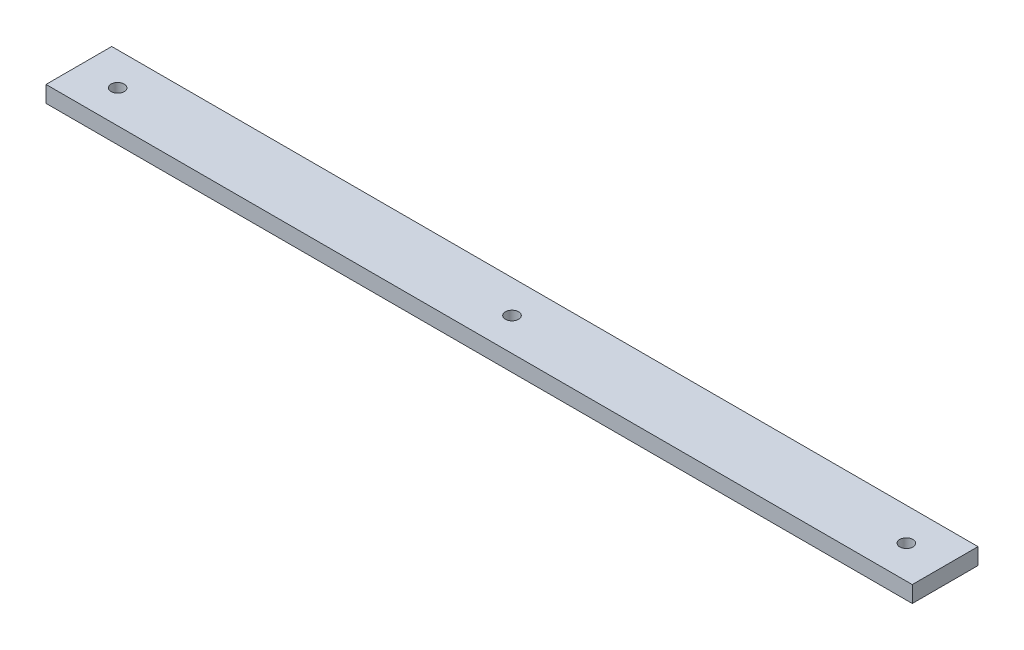
ISO-10303-21;
HEADER;
FILE_DESCRIPTION(('STEP AP214'),'2;1');
FILE_NAME('part.step','',(''),(''),'','','');
FILE_SCHEMA(('AUTOMOTIVE_DESIGN { 1 0 10303 214 1 1 1 1 }'));
ENDSEC;
DATA;
#1=APPLICATION_CONTEXT('core data for automotive mechanical design processes');
#2=APPLICATION_PROTOCOL_DEFINITION('international standard','automotive_design',2000,#1);
#3=PRODUCT_CONTEXT('',#1,'mechanical');
#4=PRODUCT('Part','Part','',(#3));
#5=PRODUCT_RELATED_PRODUCT_CATEGORY('part','',(#4));
#6=PRODUCT_DEFINITION_FORMATION('','',#4);
#7=PRODUCT_DEFINITION_CONTEXT('part definition',#1,'design');
#8=PRODUCT_DEFINITION('design','',#6,#7);
#9=PRODUCT_DEFINITION_SHAPE('','',#8);
#10=(LENGTH_UNIT() NAMED_UNIT(*) SI_UNIT(.MILLI.,.METRE.));
#11=(NAMED_UNIT(*) PLANE_ANGLE_UNIT() SI_UNIT($,.RADIAN.));
#12=(NAMED_UNIT(*) SI_UNIT($,.STERADIAN.) SOLID_ANGLE_UNIT());
#13=UNCERTAINTY_MEASURE_WITH_UNIT(LENGTH_MEASURE(1.E-05),#10,'distance_accuracy_value','');
#14=(GEOMETRIC_REPRESENTATION_CONTEXT(3) GLOBAL_UNCERTAINTY_ASSIGNED_CONTEXT((#13)) GLOBAL_UNIT_ASSIGNED_CONTEXT((#10,
#11,#12)) REPRESENTATION_CONTEXT('',''));
#15=CARTESIAN_POINT('',(0.,0.,0.));
#16=DIRECTION('',(0.,0.,1.));
#17=DIRECTION('',(1.,0.,0.));
#18=AXIS2_PLACEMENT_3D('',#15,#16,#17);
#19=CARTESIAN_POINT('',(0.,5.,10.));
#20=DIRECTION('',(0.,0.,-1.));
#21=DIRECTION('',(-1.,0.,0.));
#22=AXIS2_PLACEMENT_3D('',#19,#20,#21);
#23=PLANE('',#22);
#24=DIRECTION('',(1.,0.,0.));
#25=VECTOR('',#24,1.);
#26=CARTESIAN_POINT('',(0.,0.,10.));
#27=LINE('',#26,#25);
#28=CARTESIAN_POINT('',(-131.8,0.,10.));
#29=VERTEX_POINT('',#28);
#30=CARTESIAN_POINT('',(131.8,0.,10.));
#31=VERTEX_POINT('',#30);
#32=EDGE_CURVE('E107',#29,#31,#27,.T.);
#33=ORIENTED_EDGE('',*,*,#32,.T.);
#34=DIRECTION('',(0.,-1.,0.));
#35=VECTOR('',#34,1.);
#36=CARTESIAN_POINT('',(131.8,5.,10.));
#37=LINE('',#36,#35);
#38=CARTESIAN_POINT('',(131.8,5.,10.));
#39=VERTEX_POINT('',#38);
#40=EDGE_CURVE('E11',#39,#31,#37,.T.);
#41=ORIENTED_EDGE('',*,*,#40,.F.);
#42=DIRECTION('',(1.,0.,0.));
#43=VECTOR('',#42,1.);
#44=CARTESIAN_POINT('',(0.,5.,10.));
#45=LINE('',#44,#43);
#46=CARTESIAN_POINT('',(-131.8,5.,10.));
#47=VERTEX_POINT('',#46);
#48=EDGE_CURVE('E75',#47,#39,#45,.T.);
#49=ORIENTED_EDGE('',*,*,#48,.F.);
#50=DIRECTION('',(0.,-1.,0.));
#51=VECTOR('',#50,1.);
#52=CARTESIAN_POINT('',(-131.8,5.,10.));
#53=LINE('',#52,#51);
#54=EDGE_CURVE('E94',#47,#29,#53,.T.);
#55=ORIENTED_EDGE('',*,*,#54,.T.);
#56=EDGE_LOOP('',(#33,#41,#49,#55));
#57=FACE_BOUND('',#56,.T.);
#58=ADVANCED_FACE('F35',(#57),#23,.F.);
#59=CARTESIAN_POINT('',(131.8,5.,0.));
#60=DIRECTION('',(1.,0.,0.));
#61=DIRECTION('',(0.,0.,-1.));
#62=AXIS2_PLACEMENT_3D('',#59,#60,#61);
#63=PLANE('',#62);
#64=DIRECTION('',(0.,0.,1.));
#65=VECTOR('',#64,1.);
#66=CARTESIAN_POINT('',(131.8,0.,0.));
#67=LINE('',#66,#65);
#68=CARTESIAN_POINT('',(131.8,0.,-10.));
#69=VERTEX_POINT('',#68);
#70=EDGE_CURVE('E84',#69,#31,#67,.T.);
#71=ORIENTED_EDGE('',*,*,#70,.F.);
#72=DIRECTION('',(0.,-1.,0.));
#73=VECTOR('',#72,1.);
#74=CARTESIAN_POINT('',(131.8,5.,-10.));
#75=LINE('',#74,#73);
#76=CARTESIAN_POINT('',(131.8,5.,-10.));
#77=VERTEX_POINT('',#76);
#78=EDGE_CURVE('E44',#77,#69,#75,.T.);
#79=ORIENTED_EDGE('',*,*,#78,.F.);
#80=DIRECTION('',(0.,0.,1.));
#81=VECTOR('',#80,1.);
#82=CARTESIAN_POINT('',(131.8,5.,0.));
#83=LINE('',#82,#81);
#84=EDGE_CURVE('E82',#77,#39,#83,.T.);
#85=ORIENTED_EDGE('',*,*,#84,.T.);
#86=ORIENTED_EDGE('',*,*,#40,.T.);
#87=EDGE_LOOP('',(#71,#79,#85,#86));
#88=FACE_BOUND('',#87,.T.);
#89=ADVANCED_FACE('F81',(#88),#63,.T.);
#90=CARTESIAN_POINT('',(0.,5.,-10.));
#91=DIRECTION('',(0.,0.,-1.));
#92=DIRECTION('',(-1.,0.,0.));
#93=AXIS2_PLACEMENT_3D('',#90,#91,#92);
#94=PLANE('',#93);
#95=DIRECTION('',(1.,0.,0.));
#96=VECTOR('',#95,1.);
#97=CARTESIAN_POINT('',(0.,0.,-10.));
#98=LINE('',#97,#96);
#99=CARTESIAN_POINT('',(-131.8,0.,-10.));
#100=VERTEX_POINT('',#99);
#101=EDGE_CURVE('E111',#100,#69,#98,.T.);
#102=ORIENTED_EDGE('',*,*,#101,.F.);
#103=DIRECTION('',(0.,-1.,0.));
#104=VECTOR('',#103,1.);
#105=CARTESIAN_POINT('',(-131.8,5.,-10.));
#106=LINE('',#105,#104);
#107=CARTESIAN_POINT('',(-131.8,5.,-10.));
#108=VERTEX_POINT('',#107);
#109=EDGE_CURVE('E67',#108,#100,#106,.T.);
#110=ORIENTED_EDGE('',*,*,#109,.F.);
#111=DIRECTION('',(1.,0.,0.));
#112=VECTOR('',#111,1.);
#113=CARTESIAN_POINT('',(0.,5.,-10.));
#114=LINE('',#113,#112);
#115=EDGE_CURVE('E90',#108,#77,#114,.T.);
#116=ORIENTED_EDGE('',*,*,#115,.T.);
#117=ORIENTED_EDGE('',*,*,#78,.T.);
#118=EDGE_LOOP('',(#102,#110,#116,#117));
#119=FACE_BOUND('',#118,.T.);
#120=ADVANCED_FACE('F92',(#119),#94,.T.);
#121=CARTESIAN_POINT('',(-120.,5.,0.));
#122=DIRECTION('',(0.,-1.,0.));
#123=DIRECTION('',(0.,0.,-1.));
#124=AXIS2_PLACEMENT_3D('',#121,#122,#123);
#125=CYLINDRICAL_SURFACE('',#124,2.);
#126=CARTESIAN_POINT('',(-120.,5.,0.));
#127=DIRECTION('',(0.,1.,0.));
#128=DIRECTION('',(0.,0.,1.));
#129=AXIS2_PLACEMENT_3D('',#126,#127,#128);
#130=CIRCLE('',#129,2.);
#131=CARTESIAN_POINT('',(-120.,5.,2.));
#132=VERTEX_POINT('',#131);
#133=EDGE_CURVE('E158',#132,#132,#130,.T.);
#134=ORIENTED_EDGE('',*,*,#133,.T.);
#135=EDGE_LOOP('',(#134));
#136=FACE_BOUND('',#135,.T.);
#137=CARTESIAN_POINT('',(-120.,0.,0.));
#138=DIRECTION('',(0.,1.,0.));
#139=DIRECTION('',(0.,0.,1.));
#140=AXIS2_PLACEMENT_3D('',#137,#138,#139);
#141=CIRCLE('',#140,2.);
#142=CARTESIAN_POINT('',(-120.,0.,2.));
#143=VERTEX_POINT('',#142);
#144=EDGE_CURVE('E104',#143,#143,#141,.T.);
#145=ORIENTED_EDGE('',*,*,#144,.F.);
#146=EDGE_LOOP('',(#145));
#147=FACE_BOUND('',#146,.T.);
#148=ADVANCED_FACE('F139',(#136,#147),#125,.F.);
#149=CARTESIAN_POINT('',(0.,5.,0.));
#150=DIRECTION('',(0.,-1.,0.));
#151=DIRECTION('',(0.,0.,-1.));
#152=AXIS2_PLACEMENT_3D('',#149,#150,#151);
#153=CYLINDRICAL_SURFACE('',#152,2.);
#154=CARTESIAN_POINT('',(0.,5.,0.));
#155=DIRECTION('',(0.,1.,0.));
#156=DIRECTION('',(0.,0.,1.));
#157=AXIS2_PLACEMENT_3D('',#154,#155,#156);
#158=CIRCLE('',#157,2.);
#159=CARTESIAN_POINT('',(0.,5.,2.));
#160=VERTEX_POINT('',#159);
#161=EDGE_CURVE('E152',#160,#160,#158,.T.);
#162=ORIENTED_EDGE('',*,*,#161,.T.);
#163=EDGE_LOOP('',(#162));
#164=FACE_BOUND('',#163,.T.);
#165=CARTESIAN_POINT('',(0.,0.,0.));
#166=DIRECTION('',(0.,1.,0.));
#167=DIRECTION('',(0.,0.,1.));
#168=AXIS2_PLACEMENT_3D('',#165,#166,#167);
#169=CIRCLE('',#168,2.);
#170=CARTESIAN_POINT('',(0.,0.,2.));
#171=VERTEX_POINT('',#170);
#172=EDGE_CURVE('E101',#171,#171,#169,.T.);
#173=ORIENTED_EDGE('',*,*,#172,.F.);
#174=EDGE_LOOP('',(#173));
#175=FACE_BOUND('',#174,.T.);
#176=ADVANCED_FACE('F141',(#164,#175),#153,.F.);
#177=CARTESIAN_POINT('',(120.,5.,0.));
#178=DIRECTION('',(0.,-1.,0.));
#179=DIRECTION('',(0.,0.,-1.));
#180=AXIS2_PLACEMENT_3D('',#177,#178,#179);
#181=CYLINDRICAL_SURFACE('',#180,2.);
#182=CARTESIAN_POINT('',(120.,5.,0.));
#183=DIRECTION('',(0.,1.,0.));
#184=DIRECTION('',(0.,0.,1.));
#185=AXIS2_PLACEMENT_3D('',#182,#183,#184);
#186=CIRCLE('',#185,2.);
#187=CARTESIAN_POINT('',(120.,5.,1.99999999999999));
#188=VERTEX_POINT('',#187);
#189=EDGE_CURVE('E114',#188,#188,#186,.T.);
#190=ORIENTED_EDGE('',*,*,#189,.T.);
#191=EDGE_LOOP('',(#190));
#192=FACE_BOUND('',#191,.T.);
#193=CARTESIAN_POINT('',(120.,0.,0.));
#194=DIRECTION('',(0.,1.,0.));
#195=DIRECTION('',(0.,0.,1.));
#196=AXIS2_PLACEMENT_3D('',#193,#194,#195);
#197=CIRCLE('',#196,2.);
#198=CARTESIAN_POINT('',(120.,0.,1.99999999999999));
#199=VERTEX_POINT('',#198);
#200=EDGE_CURVE('E98',#199,#199,#197,.T.);
#201=ORIENTED_EDGE('',*,*,#200,.F.);
#202=EDGE_LOOP('',(#201));
#203=FACE_BOUND('',#202,.T.);
#204=ADVANCED_FACE('F37',(#192,#203),#181,.F.);
#205=CARTESIAN_POINT('',(-131.8,5.,0.));
#206=DIRECTION('',(1.,0.,0.));
#207=DIRECTION('',(0.,0.,-1.));
#208=AXIS2_PLACEMENT_3D('',#205,#206,#207);
#209=PLANE('',#208);
#210=DIRECTION('',(0.,0.,1.));
#211=VECTOR('',#210,1.);
#212=CARTESIAN_POINT('',(-131.8,0.,0.));
#213=LINE('',#212,#211);
#214=EDGE_CURVE('E70',#100,#29,#213,.T.);
#215=ORIENTED_EDGE('',*,*,#214,.T.);
#216=ORIENTED_EDGE('',*,*,#54,.F.);
#217=DIRECTION('',(0.,0.,1.));
#218=VECTOR('',#217,1.);
#219=CARTESIAN_POINT('',(-131.8,5.,0.));
#220=LINE('',#219,#218);
#221=EDGE_CURVE('E52',#108,#47,#220,.T.);
#222=ORIENTED_EDGE('',*,*,#221,.F.);
#223=ORIENTED_EDGE('',*,*,#109,.T.);
#224=EDGE_LOOP('',(#215,#216,#222,#223));
#225=FACE_BOUND('',#224,.T.);
#226=ADVANCED_FACE('F126',(#225),#209,.F.);
#227=CARTESIAN_POINT('',(0.,5.,0.));
#228=DIRECTION('',(0.,1.,0.));
#229=DIRECTION('',(0.,0.,1.));
#230=AXIS2_PLACEMENT_3D('',#227,#228,#229);
#231=PLANE('',#230);
#232=ORIENTED_EDGE('',*,*,#189,.F.);
#233=EDGE_LOOP('',(#232));
#234=FACE_BOUND('',#233,.T.);
#235=ORIENTED_EDGE('',*,*,#161,.F.);
#236=EDGE_LOOP('',(#235));
#237=FACE_BOUND('',#236,.T.);
#238=ORIENTED_EDGE('',*,*,#133,.F.);
#239=EDGE_LOOP('',(#238));
#240=FACE_BOUND('',#239,.T.);
#241=ORIENTED_EDGE('',*,*,#48,.T.);
#242=ORIENTED_EDGE('',*,*,#84,.F.);
#243=ORIENTED_EDGE('',*,*,#115,.F.);
#244=ORIENTED_EDGE('',*,*,#221,.T.);
#245=EDGE_LOOP('',(#241,#242,#243,#244));
#246=FACE_BOUND('',#245,.T.);
#247=ADVANCED_FACE('F89',(#234,#237,#240,#246),#231,.T.);
#248=CARTESIAN_POINT('',(0.,0.,0.));
#249=DIRECTION('',(0.,1.,0.));
#250=DIRECTION('',(0.,0.,1.));
#251=AXIS2_PLACEMENT_3D('',#248,#249,#250);
#252=PLANE('',#251);
#253=ORIENTED_EDGE('',*,*,#200,.T.);
#254=EDGE_LOOP('',(#253));
#255=FACE_BOUND('',#254,.T.);
#256=ORIENTED_EDGE('',*,*,#172,.T.);
#257=EDGE_LOOP('',(#256));
#258=FACE_BOUND('',#257,.T.);
#259=ORIENTED_EDGE('',*,*,#144,.T.);
#260=EDGE_LOOP('',(#259));
#261=FACE_BOUND('',#260,.T.);
#262=ORIENTED_EDGE('',*,*,#32,.F.);
#263=ORIENTED_EDGE('',*,*,#214,.F.);
#264=ORIENTED_EDGE('',*,*,#101,.T.);
#265=ORIENTED_EDGE('',*,*,#70,.T.);
#266=EDGE_LOOP('',(#262,#263,#264,#265));
#267=FACE_BOUND('',#266,.T.);
#268=ADVANCED_FACE('F119',(#255,#258,#261,#267),#252,.F.);
#269=CLOSED_SHELL('',(#58,#89,#120,#148,#176,#204,#226,#247,#268));
#270=MANIFOLD_SOLID_BREP('B2',#269);
#271=ADVANCED_BREP_SHAPE_REPRESENTATION('',(#18,#270),#14);
#272=SHAPE_DEFINITION_REPRESENTATION(#9,#271);
ENDSEC;
END-ISO-10303-21;
